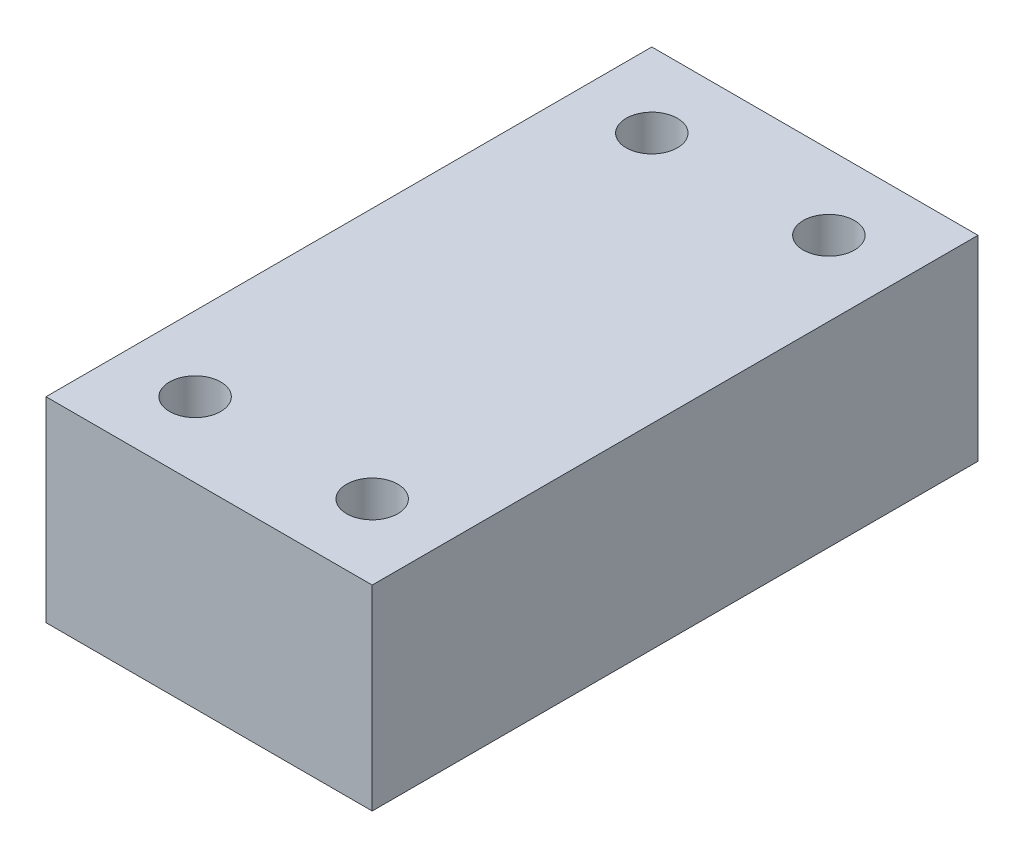
ISO-10303-21;
HEADER;
FILE_DESCRIPTION(('STEP AP214'),'2;1');
FILE_NAME('part.step','',(''),(''),'','','');
FILE_SCHEMA(('AUTOMOTIVE_DESIGN { 1 0 10303 214 1 1 1 1 }'));
ENDSEC;
DATA;
#1=APPLICATION_CONTEXT('core data for automotive mechanical design processes');
#2=APPLICATION_PROTOCOL_DEFINITION('international standard','automotive_design',2000,#1);
#3=PRODUCT_CONTEXT('',#1,'mechanical');
#4=PRODUCT('Part','Part','',(#3));
#5=PRODUCT_RELATED_PRODUCT_CATEGORY('part','',(#4));
#6=PRODUCT_DEFINITION_FORMATION('','',#4);
#7=PRODUCT_DEFINITION_CONTEXT('part definition',#1,'design');
#8=PRODUCT_DEFINITION('design','',#6,#7);
#9=PRODUCT_DEFINITION_SHAPE('','',#8);
#10=(LENGTH_UNIT() NAMED_UNIT(*) SI_UNIT(.MILLI.,.METRE.));
#11=(NAMED_UNIT(*) PLANE_ANGLE_UNIT() SI_UNIT($,.RADIAN.));
#12=(NAMED_UNIT(*) SI_UNIT($,.STERADIAN.) SOLID_ANGLE_UNIT());
#13=UNCERTAINTY_MEASURE_WITH_UNIT(LENGTH_MEASURE(1.E-05),#10,'distance_accuracy_value','');
#14=(GEOMETRIC_REPRESENTATION_CONTEXT(3) GLOBAL_UNCERTAINTY_ASSIGNED_CONTEXT((#13)) GLOBAL_UNIT_ASSIGNED_CONTEXT((#10,
#11,#12)) REPRESENTATION_CONTEXT('',''));
#15=CARTESIAN_POINT('',(0.,0.,0.));
#16=DIRECTION('',(0.,0.,1.));
#17=DIRECTION('',(1.,0.,0.));
#18=AXIS2_PLACEMENT_3D('',#15,#16,#17);
#19=CARTESIAN_POINT('',(-17.5,21.,-32.5));
#20=DIRECTION('',(1.,0.,0.));
#21=DIRECTION('',(0.,0.,-1.));
#22=AXIS2_PLACEMENT_3D('',#19,#20,#21);
#23=PLANE('',#22);
#24=DIRECTION('',(0.,0.,1.));
#25=VECTOR('',#24,1.);
#26=CARTESIAN_POINT('',(-17.5,0.,-32.5));
#27=LINE('',#26,#25);
#28=CARTESIAN_POINT('',(-17.5,0.,-32.5));
#29=VERTEX_POINT('',#28);
#30=CARTESIAN_POINT('',(-17.5,0.,32.5));
#31=VERTEX_POINT('',#30);
#32=EDGE_CURVE('E95',#29,#31,#27,.T.);
#33=ORIENTED_EDGE('',*,*,#32,.T.);
#34=DIRECTION('',(0.,-1.,0.));
#35=VECTOR('',#34,1.);
#36=CARTESIAN_POINT('',(-17.5,21.,32.5));
#37=LINE('',#36,#35);
#38=CARTESIAN_POINT('',(-17.5,21.,32.5));
#39=VERTEX_POINT('',#38);
#40=EDGE_CURVE('E11',#39,#31,#37,.T.);
#41=ORIENTED_EDGE('',*,*,#40,.F.);
#42=DIRECTION('',(0.,0.,1.));
#43=VECTOR('',#42,1.);
#44=CARTESIAN_POINT('',(-17.5,21.,-32.5));
#45=LINE('',#44,#43);
#46=CARTESIAN_POINT('',(-17.5,21.,-32.5));
#47=VERTEX_POINT('',#46);
#48=EDGE_CURVE('E83',#47,#39,#45,.T.);
#49=ORIENTED_EDGE('',*,*,#48,.F.);
#50=DIRECTION('',(0.,-1.,0.));
#51=VECTOR('',#50,1.);
#52=CARTESIAN_POINT('',(-17.5,21.,-32.5));
#53=LINE('',#52,#51);
#54=EDGE_CURVE('E91',#47,#29,#53,.T.);
#55=ORIENTED_EDGE('',*,*,#54,.T.);
#56=EDGE_LOOP('',(#33,#41,#49,#55));
#57=FACE_BOUND('',#56,.T.);
#58=ADVANCED_FACE('F32',(#57),#23,.F.);
#59=CARTESIAN_POINT('',(-17.5,21.,32.5));
#60=DIRECTION('',(0.,0.,-1.));
#61=DIRECTION('',(-1.,0.,0.));
#62=AXIS2_PLACEMENT_3D('',#59,#60,#61);
#63=PLANE('',#62);
#64=DIRECTION('',(1.,0.,0.));
#65=VECTOR('',#64,1.);
#66=CARTESIAN_POINT('',(-17.5,0.,32.5));
#67=LINE('',#66,#65);
#68=CARTESIAN_POINT('',(17.5,0.,32.5));
#69=VERTEX_POINT('',#68);
#70=EDGE_CURVE('E87',#31,#69,#67,.T.);
#71=ORIENTED_EDGE('',*,*,#70,.T.);
#72=DIRECTION('',(0.,-1.,0.));
#73=VECTOR('',#72,1.);
#74=CARTESIAN_POINT('',(17.5,21.,32.5));
#75=LINE('',#74,#73);
#76=CARTESIAN_POINT('',(17.5,21.,32.5));
#77=VERTEX_POINT('',#76);
#78=EDGE_CURVE('E40',#77,#69,#75,.T.);
#79=ORIENTED_EDGE('',*,*,#78,.F.);
#80=DIRECTION('',(1.,0.,0.));
#81=VECTOR('',#80,1.);
#82=CARTESIAN_POINT('',(-17.5,21.,32.5));
#83=LINE('',#82,#81);
#84=EDGE_CURVE('E78',#39,#77,#83,.T.);
#85=ORIENTED_EDGE('',*,*,#84,.F.);
#86=ORIENTED_EDGE('',*,*,#40,.T.);
#87=EDGE_LOOP('',(#71,#79,#85,#86));
#88=FACE_BOUND('',#87,.T.);
#89=ADVANCED_FACE('F86',(#88),#63,.F.);
#90=CARTESIAN_POINT('',(17.5,21.,-32.5));
#91=DIRECTION('',(-1.,0.,0.));
#92=DIRECTION('',(0.,0.,1.));
#93=AXIS2_PLACEMENT_3D('',#90,#91,#92);
#94=PLANE('',#93);
#95=DIRECTION('',(0.,0.,-1.));
#96=VECTOR('',#95,1.);
#97=CARTESIAN_POINT('',(17.5,0.,-32.5));
#98=LINE('',#97,#96);
#99=CARTESIAN_POINT('',(17.5,0.,-32.5));
#100=VERTEX_POINT('',#99);
#101=EDGE_CURVE('E65',#69,#100,#98,.T.);
#102=ORIENTED_EDGE('',*,*,#101,.T.);
#103=DIRECTION('',(0.,-1.,0.));
#104=VECTOR('',#103,1.);
#105=CARTESIAN_POINT('',(17.5,21.,-32.5));
#106=LINE('',#105,#104);
#107=CARTESIAN_POINT('',(17.5,21.,-32.5));
#108=VERTEX_POINT('',#107);
#109=EDGE_CURVE('E88',#108,#100,#106,.T.);
#110=ORIENTED_EDGE('',*,*,#109,.F.);
#111=DIRECTION('',(0.,0.,-1.));
#112=VECTOR('',#111,1.);
#113=CARTESIAN_POINT('',(17.5,21.,-32.5));
#114=LINE('',#113,#112);
#115=EDGE_CURVE('E81',#77,#108,#114,.T.);
#116=ORIENTED_EDGE('',*,*,#115,.F.);
#117=ORIENTED_EDGE('',*,*,#78,.T.);
#118=EDGE_LOOP('',(#102,#110,#116,#117));
#119=FACE_BOUND('',#118,.T.);
#120=ADVANCED_FACE('F89',(#119),#94,.F.);
#121=CARTESIAN_POINT('',(-17.5,21.,-32.5));
#122=DIRECTION('',(0.,0.,1.));
#123=DIRECTION('',(1.,0.,0.));
#124=AXIS2_PLACEMENT_3D('',#121,#122,#123);
#125=PLANE('',#124);
#126=DIRECTION('',(-1.,0.,0.));
#127=VECTOR('',#126,1.);
#128=CARTESIAN_POINT('',(-17.5,0.,-32.5));
#129=LINE('',#128,#127);
#130=EDGE_CURVE('E71',#100,#29,#129,.T.);
#131=ORIENTED_EDGE('',*,*,#130,.T.);
#132=ORIENTED_EDGE('',*,*,#54,.F.);
#133=DIRECTION('',(-1.,0.,0.));
#134=VECTOR('',#133,1.);
#135=CARTESIAN_POINT('',(-17.5,21.,-32.5));
#136=LINE('',#135,#134);
#137=EDGE_CURVE('E48',#108,#47,#136,.T.);
#138=ORIENTED_EDGE('',*,*,#137,.F.);
#139=ORIENTED_EDGE('',*,*,#109,.T.);
#140=EDGE_LOOP('',(#131,#132,#138,#139));
#141=FACE_BOUND('',#140,.T.);
#142=ADVANCED_FACE('F103',(#141),#125,.F.);
#143=CARTESIAN_POINT('',(0.,21.,0.));
#144=DIRECTION('',(0.,1.,0.));
#145=DIRECTION('',(0.,0.,1.));
#146=AXIS2_PLACEMENT_3D('',#143,#144,#145);
#147=PLANE('',#146);
#148=CARTESIAN_POINT('',(9.49999999999998,21.,-24.5));
#149=DIRECTION('',(0.,1.,0.));
#150=DIRECTION('',(0.,0.,1.));
#151=AXIS2_PLACEMENT_3D('',#148,#149,#150);
#152=CIRCLE('',#151,2.74999999999999);
#153=CARTESIAN_POINT('',(9.49999999999998,21.,-21.75));
#154=VERTEX_POINT('',#153);
#155=EDGE_CURVE('E129',#154,#154,#152,.T.);
#156=ORIENTED_EDGE('',*,*,#155,.F.);
#157=EDGE_LOOP('',(#156));
#158=FACE_BOUND('',#157,.T.);
#159=CARTESIAN_POINT('',(-9.50000000000001,21.,-24.5));
#160=DIRECTION('',(0.,1.,0.));
#161=DIRECTION('',(0.,0.,1.));
#162=AXIS2_PLACEMENT_3D('',#159,#160,#161);
#163=CIRCLE('',#162,2.74999999999999);
#164=CARTESIAN_POINT('',(-9.50000000000001,21.,-21.75));
#165=VERTEX_POINT('',#164);
#166=EDGE_CURVE('E123',#165,#165,#163,.T.);
#167=ORIENTED_EDGE('',*,*,#166,.F.);
#168=EDGE_LOOP('',(#167));
#169=FACE_BOUND('',#168,.T.);
#170=CARTESIAN_POINT('',(-9.50000000000001,21.,24.5));
#171=DIRECTION('',(0.,1.,0.));
#172=DIRECTION('',(0.,0.,1.));
#173=AXIS2_PLACEMENT_3D('',#170,#171,#172);
#174=CIRCLE('',#173,2.74999999999999);
#175=CARTESIAN_POINT('',(-9.50000000000001,21.,27.25));
#176=VERTEX_POINT('',#175);
#177=EDGE_CURVE('E117',#176,#176,#174,.T.);
#178=ORIENTED_EDGE('',*,*,#177,.F.);
#179=EDGE_LOOP('',(#178));
#180=FACE_BOUND('',#179,.T.);
#181=CARTESIAN_POINT('',(9.49999999999998,21.,24.5));
#182=DIRECTION('',(0.,1.,0.));
#183=DIRECTION('',(0.,0.,1.));
#184=AXIS2_PLACEMENT_3D('',#181,#182,#183);
#185=CIRCLE('',#184,2.74999999999999);
#186=CARTESIAN_POINT('',(9.49999999999998,21.,27.25));
#187=VERTEX_POINT('',#186);
#188=EDGE_CURVE('E111',#187,#187,#185,.T.);
#189=ORIENTED_EDGE('',*,*,#188,.F.);
#190=EDGE_LOOP('',(#189));
#191=FACE_BOUND('',#190,.T.);
#192=ORIENTED_EDGE('',*,*,#48,.T.);
#193=ORIENTED_EDGE('',*,*,#84,.T.);
#194=ORIENTED_EDGE('',*,*,#115,.T.);
#195=ORIENTED_EDGE('',*,*,#137,.T.);
#196=EDGE_LOOP('',(#192,#193,#194,#195));
#197=FACE_BOUND('',#196,.T.);
#198=ADVANCED_FACE('F79',(#158,#169,#180,#191,#197),#147,.T.);
#199=CARTESIAN_POINT('',(0.,0.,0.));
#200=DIRECTION('',(0.,1.,0.));
#201=DIRECTION('',(0.,0.,1.));
#202=AXIS2_PLACEMENT_3D('',#199,#200,#201);
#203=PLANE('',#202);
#204=CARTESIAN_POINT('',(9.49999999999998,0.,-24.5));
#205=DIRECTION('',(0.,1.,0.));
#206=DIRECTION('',(0.,0.,1.));
#207=AXIS2_PLACEMENT_3D('',#204,#205,#206);
#208=CIRCLE('',#207,2.74999999999998);
#209=CARTESIAN_POINT('',(9.49999999999998,0.,-21.75));
#210=VERTEX_POINT('',#209);
#211=EDGE_CURVE('E126',#210,#210,#208,.T.);
#212=ORIENTED_EDGE('',*,*,#211,.T.);
#213=EDGE_LOOP('',(#212));
#214=FACE_BOUND('',#213,.T.);
#215=CARTESIAN_POINT('',(-9.50000000000001,0.,-24.5));
#216=DIRECTION('',(0.,1.,0.));
#217=DIRECTION('',(0.,0.,1.));
#218=AXIS2_PLACEMENT_3D('',#215,#216,#217);
#219=CIRCLE('',#218,2.74999999999998);
#220=CARTESIAN_POINT('',(-9.50000000000001,0.,-21.75));
#221=VERTEX_POINT('',#220);
#222=EDGE_CURVE('E120',#221,#221,#219,.T.);
#223=ORIENTED_EDGE('',*,*,#222,.T.);
#224=EDGE_LOOP('',(#223));
#225=FACE_BOUND('',#224,.T.);
#226=CARTESIAN_POINT('',(-9.50000000000001,0.,24.5));
#227=DIRECTION('',(0.,1.,0.));
#228=DIRECTION('',(0.,0.,1.));
#229=AXIS2_PLACEMENT_3D('',#226,#227,#228);
#230=CIRCLE('',#229,2.74999999999998);
#231=CARTESIAN_POINT('',(-9.50000000000001,0.,27.25));
#232=VERTEX_POINT('',#231);
#233=EDGE_CURVE('E114',#232,#232,#230,.T.);
#234=ORIENTED_EDGE('',*,*,#233,.T.);
#235=EDGE_LOOP('',(#234));
#236=FACE_BOUND('',#235,.T.);
#237=CARTESIAN_POINT('',(9.49999999999998,0.,24.5));
#238=DIRECTION('',(0.,1.,0.));
#239=DIRECTION('',(0.,0.,1.));
#240=AXIS2_PLACEMENT_3D('',#237,#238,#239);
#241=CIRCLE('',#240,2.74999999999998);
#242=CARTESIAN_POINT('',(9.49999999999998,0.,27.25));
#243=VERTEX_POINT('',#242);
#244=EDGE_CURVE('E98',#243,#243,#241,.T.);
#245=ORIENTED_EDGE('',*,*,#244,.T.);
#246=EDGE_LOOP('',(#245));
#247=FACE_BOUND('',#246,.T.);
#248=ORIENTED_EDGE('',*,*,#32,.F.);
#249=ORIENTED_EDGE('',*,*,#130,.F.);
#250=ORIENTED_EDGE('',*,*,#101,.F.);
#251=ORIENTED_EDGE('',*,*,#70,.F.);
#252=EDGE_LOOP('',(#248,#249,#250,#251));
#253=FACE_BOUND('',#252,.T.);
#254=ADVANCED_FACE('F106',(#214,#225,#236,#247,#253),#203,.F.);
#255=CARTESIAN_POINT('',(9.49999999999998,21.,24.5));
#256=DIRECTION('',(0.,1.,0.));
#257=DIRECTION('',(0.,0.,1.));
#258=AXIS2_PLACEMENT_3D('',#255,#256,#257);
#259=CYLINDRICAL_SURFACE('',#258,2.74999999999999);
#260=ORIENTED_EDGE('',*,*,#244,.F.);
#261=EDGE_LOOP('',(#260));
#262=FACE_BOUND('',#261,.T.);
#263=ORIENTED_EDGE('',*,*,#188,.T.);
#264=EDGE_LOOP('',(#263));
#265=FACE_BOUND('',#264,.T.);
#266=ADVANCED_FACE('F144',(#262,#265),#259,.F.);
#267=CARTESIAN_POINT('',(-9.50000000000001,21.,24.5));
#268=DIRECTION('',(0.,1.,0.));
#269=DIRECTION('',(0.,0.,1.));
#270=AXIS2_PLACEMENT_3D('',#267,#268,#269);
#271=CYLINDRICAL_SURFACE('',#270,2.74999999999999);
#272=ORIENTED_EDGE('',*,*,#233,.F.);
#273=EDGE_LOOP('',(#272));
#274=FACE_BOUND('',#273,.T.);
#275=ORIENTED_EDGE('',*,*,#177,.T.);
#276=EDGE_LOOP('',(#275));
#277=FACE_BOUND('',#276,.T.);
#278=ADVANCED_FACE('F146',(#274,#277),#271,.F.);
#279=CARTESIAN_POINT('',(-9.50000000000001,21.,-24.5));
#280=DIRECTION('',(0.,1.,0.));
#281=DIRECTION('',(0.,0.,1.));
#282=AXIS2_PLACEMENT_3D('',#279,#280,#281);
#283=CYLINDRICAL_SURFACE('',#282,2.74999999999999);
#284=ORIENTED_EDGE('',*,*,#222,.F.);
#285=EDGE_LOOP('',(#284));
#286=FACE_BOUND('',#285,.T.);
#287=ORIENTED_EDGE('',*,*,#166,.T.);
#288=EDGE_LOOP('',(#287));
#289=FACE_BOUND('',#288,.T.);
#290=ADVANCED_FACE('F153',(#286,#289),#283,.F.);
#291=CARTESIAN_POINT('',(9.49999999999998,21.,-24.5));
#292=DIRECTION('',(0.,1.,0.));
#293=DIRECTION('',(0.,0.,1.));
#294=AXIS2_PLACEMENT_3D('',#291,#292,#293);
#295=CYLINDRICAL_SURFACE('',#294,2.74999999999999);
#296=ORIENTED_EDGE('',*,*,#211,.F.);
#297=EDGE_LOOP('',(#296));
#298=FACE_BOUND('',#297,.T.);
#299=ORIENTED_EDGE('',*,*,#155,.T.);
#300=EDGE_LOOP('',(#299));
#301=FACE_BOUND('',#300,.T.);
#302=ADVANCED_FACE('F133',(#298,#301),#295,.F.);
#303=CLOSED_SHELL('',(#58,#89,#120,#142,#198,#254,#266,#278,#290,#302));
#304=MANIFOLD_SOLID_BREP('B2',#303);
#305=ADVANCED_BREP_SHAPE_REPRESENTATION('',(#18,#304),#14);
#306=SHAPE_DEFINITION_REPRESENTATION(#9,#305);
ENDSEC;
END-ISO-10303-21;
